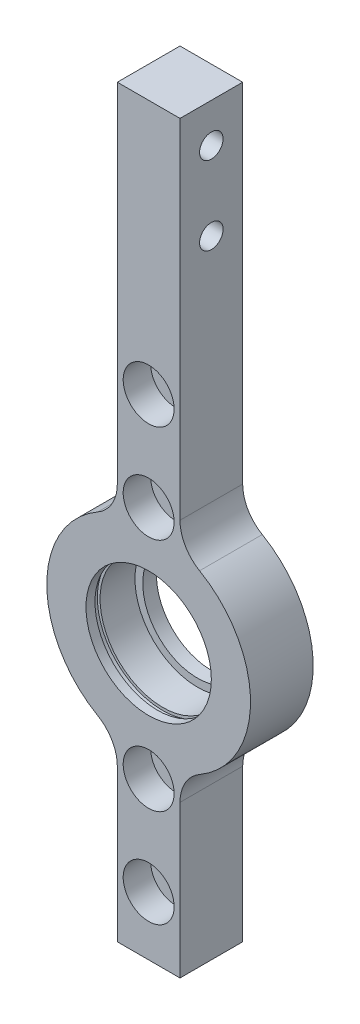
ISO-10303-21;
HEADER;
FILE_DESCRIPTION(('STEP AP214'),'2;1');
FILE_NAME('part.step','',(''),(''),'','','');
FILE_SCHEMA(('AUTOMOTIVE_DESIGN { 1 0 10303 214 1 1 1 1 }'));
ENDSEC;
DATA;
#1=APPLICATION_CONTEXT('core data for automotive mechanical design processes');
#2=APPLICATION_PROTOCOL_DEFINITION('international standard','automotive_design',2000,#1);
#3=PRODUCT_CONTEXT('',#1,'mechanical');
#4=PRODUCT('Part','Part','',(#3));
#5=PRODUCT_RELATED_PRODUCT_CATEGORY('part','',(#4));
#6=PRODUCT_DEFINITION_FORMATION('','',#4);
#7=PRODUCT_DEFINITION_CONTEXT('part definition',#1,'design');
#8=PRODUCT_DEFINITION('design','',#6,#7);
#9=PRODUCT_DEFINITION_SHAPE('','',#8);
#10=(LENGTH_UNIT() NAMED_UNIT(*) SI_UNIT(.MILLI.,.METRE.));
#11=(NAMED_UNIT(*) PLANE_ANGLE_UNIT() SI_UNIT($,.RADIAN.));
#12=(NAMED_UNIT(*) SI_UNIT($,.STERADIAN.) SOLID_ANGLE_UNIT());
#13=UNCERTAINTY_MEASURE_WITH_UNIT(LENGTH_MEASURE(1.E-05),#10,'distance_accuracy_value','');
#14=(GEOMETRIC_REPRESENTATION_CONTEXT(3) GLOBAL_UNCERTAINTY_ASSIGNED_CONTEXT((#13)) GLOBAL_UNIT_ASSIGNED_CONTEXT((#10,
#11,#12)) REPRESENTATION_CONTEXT('',''));
#15=CARTESIAN_POINT('',(0.,0.,0.));
#16=DIRECTION('',(0.,0.,1.));
#17=DIRECTION('',(1.,0.,0.));
#18=AXIS2_PLACEMENT_3D('',#15,#16,#17);
#19=CARTESIAN_POINT('',(0.,0.,-8.));
#20=DIRECTION('',(0.,0.,1.));
#21=DIRECTION('',(1.,0.,0.));
#22=AXIS2_PLACEMENT_3D('',#19,#20,#21);
#23=PLANE('',#22);
#24=CARTESIAN_POINT('',(0.,30.,-8.));
#25=DIRECTION('',(0.,0.,-1.));
#26=DIRECTION('',(1.,0.,0.));
#27=AXIS2_PLACEMENT_3D('',#24,#25,#26);
#28=CIRCLE('',#27,3.);
#29=CARTESIAN_POINT('',(3.,30.,-8.));
#30=VERTEX_POINT('',#29);
#31=EDGE_CURVE('E256',#30,#30,#28,.T.);
#32=ORIENTED_EDGE('',*,*,#31,.F.);
#33=EDGE_LOOP('',(#32));
#34=FACE_BOUND('',#33,.T.);
#35=CARTESIAN_POINT('',(0.,-55.,-8.));
#36=DIRECTION('',(0.,0.,1.));
#37=DIRECTION('',(1.,0.,0.));
#38=AXIS2_PLACEMENT_3D('',#35,#36,#37);
#39=CIRCLE('',#38,3.);
#40=CARTESIAN_POINT('',(3.00000000000001,-55.,-8.));
#41=VERTEX_POINT('',#40);
#42=EDGE_CURVE('E252',#41,#41,#39,.T.);
#43=ORIENTED_EDGE('',*,*,#42,.T.);
#44=EDGE_LOOP('',(#43));
#45=FACE_BOUND('',#44,.T.);
#46=CARTESIAN_POINT('',(0.,-30.,-8.));
#47=DIRECTION('',(0.,0.,1.));
#48=DIRECTION('',(1.,0.,0.));
#49=AXIS2_PLACEMENT_3D('',#46,#47,#48);
#50=CIRCLE('',#49,3.);
#51=CARTESIAN_POINT('',(3.,-30.,-8.));
#52=VERTEX_POINT('',#51);
#53=EDGE_CURVE('E249',#52,#52,#50,.T.);
#54=ORIENTED_EDGE('',*,*,#53,.T.);
#55=EDGE_LOOP('',(#54));
#56=FACE_BOUND('',#55,.T.);
#57=CARTESIAN_POINT('',(0.,0.,-8.));
#58=DIRECTION('',(0.,0.,1.));
#59=DIRECTION('',(1.,0.,0.));
#60=AXIS2_PLACEMENT_3D('',#57,#58,#59);
#61=CIRCLE('',#60,26.);
#62=CARTESIAN_POINT('',(13.,-22.5166604983954,-8.));
#63=VERTEX_POINT('',#62);
#64=CARTESIAN_POINT('',(13.,22.5166604983954,-8.));
#65=VERTEX_POINT('',#64);
#66=EDGE_CURVE('E207',#63,#65,#61,.T.);
#67=ORIENTED_EDGE('',*,*,#66,.F.);
#68=CARTESIAN_POINT('',(18.,-31.1769145362398,-8.));
#69=DIRECTION('',(0.,0.,1.));
#70=DIRECTION('',(1.,0.,0.));
#71=AXIS2_PLACEMENT_3D('',#68,#69,#70);
#72=CIRCLE('',#71,10.);
#73=CARTESIAN_POINT('',(8.,-31.1769145362398,-8.));
#74=VERTEX_POINT('',#73);
#75=EDGE_CURVE('E236',#63,#74,#72,.T.);
#76=ORIENTED_EDGE('',*,*,#75,.T.);
#77=DIRECTION('',(0.,1.,0.));
#78=VECTOR('',#77,1.);
#79=CARTESIAN_POINT('',(8.,-24.738633753706,-8.));
#80=LINE('',#79,#78);
#81=CARTESIAN_POINT('',(8.00000000000001,-70.,-8.));
#82=VERTEX_POINT('',#81);
#83=EDGE_CURVE('E139',#82,#74,#80,.T.);
#84=ORIENTED_EDGE('',*,*,#83,.F.);
#85=DIRECTION('',(1.,0.,0.));
#86=VECTOR('',#85,1.);
#87=CARTESIAN_POINT('',(-7.99999999999999,-70.,-8.));
#88=LINE('',#87,#86);
#89=CARTESIAN_POINT('',(-7.99999999999999,-70.,-8.));
#90=VERTEX_POINT('',#89);
#91=EDGE_CURVE('E160',#90,#82,#88,.T.);
#92=ORIENTED_EDGE('',*,*,#91,.F.);
#93=DIRECTION('',(0.,-1.,0.));
#94=VECTOR('',#93,1.);
#95=CARTESIAN_POINT('',(-8.,-24.738633753706,-8.));
#96=LINE('',#95,#94);
#97=CARTESIAN_POINT('',(-8.,-31.1769145362398,-8.));
#98=VERTEX_POINT('',#97);
#99=EDGE_CURVE('E145',#98,#90,#96,.T.);
#100=ORIENTED_EDGE('',*,*,#99,.F.);
#101=CARTESIAN_POINT('',(-18.,-31.1769145362398,-8.));
#102=DIRECTION('',(0.,0.,1.));
#103=DIRECTION('',(1.,0.,0.));
#104=AXIS2_PLACEMENT_3D('',#101,#102,#103);
#105=CIRCLE('',#104,10.);
#106=CARTESIAN_POINT('',(-13.,-22.5166604983954,-8.));
#107=VERTEX_POINT('',#106);
#108=EDGE_CURVE('E233',#98,#107,#105,.T.);
#109=ORIENTED_EDGE('',*,*,#108,.T.);
#110=CARTESIAN_POINT('',(-13.,22.5166604983954,-8.));
#111=VERTEX_POINT('',#110);
#112=EDGE_CURVE('E212',#111,#107,#61,.T.);
#113=ORIENTED_EDGE('',*,*,#112,.F.);
#114=CARTESIAN_POINT('',(-18.,31.1769145362398,-8.));
#115=DIRECTION('',(0.,0.,1.));
#116=DIRECTION('',(1.,0.,0.));
#117=AXIS2_PLACEMENT_3D('',#114,#115,#116);
#118=CIRCLE('',#117,10.);
#119=CARTESIAN_POINT('',(-8.00000000000001,31.1769145362398,-8.));
#120=VERTEX_POINT('',#119);
#121=EDGE_CURVE('E44',#111,#120,#118,.T.);
#122=ORIENTED_EDGE('',*,*,#121,.T.);
#123=DIRECTION('',(0.,-1.,0.));
#124=VECTOR('',#123,1.);
#125=CARTESIAN_POINT('',(-8.,120.,-8.));
#126=LINE('',#125,#124);
#127=CARTESIAN_POINT('',(-8.,120.,-8.));
#128=VERTEX_POINT('',#127);
#129=EDGE_CURVE('E190',#128,#120,#126,.T.);
#130=ORIENTED_EDGE('',*,*,#129,.F.);
#131=DIRECTION('',(-1.,0.,0.));
#132=VECTOR('',#131,1.);
#133=CARTESIAN_POINT('',(-8.,120.,-8.));
#134=LINE('',#133,#132);
#135=CARTESIAN_POINT('',(8.,120.,-8.));
#136=VERTEX_POINT('',#135);
#137=EDGE_CURVE('E196',#136,#128,#134,.T.);
#138=ORIENTED_EDGE('',*,*,#137,.F.);
#139=DIRECTION('',(0.,1.,0.));
#140=VECTOR('',#139,1.);
#141=CARTESIAN_POINT('',(8.,120.,-8.));
#142=LINE('',#141,#140);
#143=CARTESIAN_POINT('',(8.00000000000001,31.1769145362398,-8.));
#144=VERTEX_POINT('',#143);
#145=EDGE_CURVE('E186',#144,#136,#142,.T.);
#146=ORIENTED_EDGE('',*,*,#145,.F.);
#147=CARTESIAN_POINT('',(18.,31.1769145362398,-8.));
#148=DIRECTION('',(0.,0.,1.));
#149=DIRECTION('',(1.,0.,0.));
#150=AXIS2_PLACEMENT_3D('',#147,#148,#149);
#151=CIRCLE('',#150,10.);
#152=EDGE_CURVE('E240',#144,#65,#151,.T.);
#153=ORIENTED_EDGE('',*,*,#152,.T.);
#154=EDGE_LOOP('',(#67,#76,#84,#92,#100,#109,#113,#122,#130,#138,#146,#153));
#155=FACE_BOUND('',#154,.T.);
#156=CARTESIAN_POINT('',(0.,0.,-8.));
#157=DIRECTION('',(0.,0.,1.));
#158=DIRECTION('',(1.,0.,0.));
#159=AXIS2_PLACEMENT_3D('',#156,#157,#158);
#160=CIRCLE('',#159,14.);
#161=CARTESIAN_POINT('',(14.,0.,-8.));
#162=VERTEX_POINT('',#161);
#163=EDGE_CURVE('E204',#162,#162,#160,.T.);
#164=ORIENTED_EDGE('',*,*,#163,.T.);
#165=EDGE_LOOP('',(#164));
#166=FACE_BOUND('',#165,.T.);
#167=CARTESIAN_POINT('',(0.,55.,-8.));
#168=DIRECTION('',(0.,0.,-1.));
#169=DIRECTION('',(1.,0.,0.));
#170=AXIS2_PLACEMENT_3D('',#167,#168,#169);
#171=CIRCLE('',#170,3.);
#172=CARTESIAN_POINT('',(3.00000000000001,55.,-8.));
#173=VERTEX_POINT('',#172);
#174=EDGE_CURVE('E267',#173,#173,#171,.T.);
#175=ORIENTED_EDGE('',*,*,#174,.F.);
#176=EDGE_LOOP('',(#175));
#177=FACE_BOUND('',#176,.T.);
#178=ADVANCED_FACE('F35',(#34,#45,#56,#155,#166,#177),#23,.F.);
#179=CARTESIAN_POINT('',(0.,55.,1.));
#180=DIRECTION('',(0.,0.,1.));
#181=DIRECTION('',(1.,0.,0.));
#182=AXIS2_PLACEMENT_3D('',#179,#180,#181);
#183=PLANE('',#182);
#184=CARTESIAN_POINT('',(0.,55.,1.));
#185=DIRECTION('',(0.,0.,-1.));
#186=DIRECTION('',(1.,0.,0.));
#187=AXIS2_PLACEMENT_3D('',#184,#185,#186);
#188=CIRCLE('',#187,6.5);
#189=CARTESIAN_POINT('',(6.50000000000001,55.,1.));
#190=VERTEX_POINT('',#189);
#191=EDGE_CURVE('E273',#190,#190,#188,.T.);
#192=ORIENTED_EDGE('',*,*,#191,.F.);
#193=EDGE_LOOP('',(#192));
#194=FACE_BOUND('',#193,.T.);
#195=CARTESIAN_POINT('',(0.,55.,1.));
#196=DIRECTION('',(0.,0.,1.));
#197=DIRECTION('',(1.,0.,0.));
#198=AXIS2_PLACEMENT_3D('',#195,#196,#197);
#199=CIRCLE('',#198,3.);
#200=CARTESIAN_POINT('',(3.00000000000001,55.,1.));
#201=VERTEX_POINT('',#200);
#202=EDGE_CURVE('E39',#201,#201,#199,.F.);
#203=ORIENTED_EDGE('',*,*,#202,.T.);
#204=EDGE_LOOP('',(#203));
#205=FACE_BOUND('',#204,.T.);
#206=ADVANCED_FACE('F323',(#194,#205),#183,.T.);
#207=CARTESIAN_POINT('',(0.,30.,1.));
#208=DIRECTION('',(0.,0.,1.));
#209=DIRECTION('',(1.,0.,0.));
#210=AXIS2_PLACEMENT_3D('',#207,#208,#209);
#211=PLANE('',#210);
#212=CARTESIAN_POINT('',(0.,30.,1.));
#213=DIRECTION('',(0.,0.,-1.));
#214=DIRECTION('',(1.,0.,0.));
#215=AXIS2_PLACEMENT_3D('',#212,#213,#214);
#216=CIRCLE('',#215,6.5);
#217=CARTESIAN_POINT('',(6.5,30.,1.));
#218=VERTEX_POINT('',#217);
#219=EDGE_CURVE('E260',#218,#218,#216,.T.);
#220=ORIENTED_EDGE('',*,*,#219,.F.);
#221=EDGE_LOOP('',(#220));
#222=FACE_BOUND('',#221,.T.);
#223=CARTESIAN_POINT('',(0.,30.,1.));
#224=DIRECTION('',(0.,0.,1.));
#225=DIRECTION('',(1.,0.,0.));
#226=AXIS2_PLACEMENT_3D('',#223,#224,#225);
#227=CIRCLE('',#226,3.);
#228=CARTESIAN_POINT('',(3.,30.,1.));
#229=VERTEX_POINT('',#228);
#230=EDGE_CURVE('E253',#229,#229,#227,.F.);
#231=ORIENTED_EDGE('',*,*,#230,.T.);
#232=EDGE_LOOP('',(#231));
#233=FACE_BOUND('',#232,.T.);
#234=ADVANCED_FACE('F329',(#222,#233),#211,.T.);
#235=CARTESIAN_POINT('',(0.,0.,8.));
#236=DIRECTION('',(0.,0.,1.));
#237=DIRECTION('',(1.,0.,0.));
#238=AXIS2_PLACEMENT_3D('',#235,#236,#237);
#239=PLANE('',#238);
#240=CARTESIAN_POINT('',(0.,55.,8.));
#241=DIRECTION('',(0.,0.,-1.));
#242=DIRECTION('',(1.,0.,0.));
#243=AXIS2_PLACEMENT_3D('',#240,#241,#242);
#244=CIRCLE('',#243,6.5);
#245=CARTESIAN_POINT('',(6.50000000000001,55.,8.));
#246=VERTEX_POINT('',#245);
#247=EDGE_CURVE('E271',#246,#246,#244,.T.);
#248=ORIENTED_EDGE('',*,*,#247,.T.);
#249=EDGE_LOOP('',(#248));
#250=FACE_BOUND('',#249,.T.);
#251=CARTESIAN_POINT('',(0.,-30.,8.));
#252=DIRECTION('',(0.,0.,1.));
#253=DIRECTION('',(1.,0.,0.));
#254=AXIS2_PLACEMENT_3D('',#251,#252,#253);
#255=CIRCLE('',#254,6.5);
#256=CARTESIAN_POINT('',(6.5,-30.,8.));
#257=VERTEX_POINT('',#256);
#258=EDGE_CURVE('E248',#257,#257,#255,.T.);
#259=ORIENTED_EDGE('',*,*,#258,.F.);
#260=EDGE_LOOP('',(#259));
#261=FACE_BOUND('',#260,.T.);
#262=CARTESIAN_POINT('',(0.,-55.,8.));
#263=DIRECTION('',(0.,0.,1.));
#264=DIRECTION('',(1.,0.,0.));
#265=AXIS2_PLACEMENT_3D('',#262,#263,#264);
#266=CIRCLE('',#265,6.5);
#267=CARTESIAN_POINT('',(6.50000000000001,-55.,8.));
#268=VERTEX_POINT('',#267);
#269=EDGE_CURVE('E285',#268,#268,#266,.T.);
#270=ORIENTED_EDGE('',*,*,#269,.F.);
#271=EDGE_LOOP('',(#270));
#272=FACE_BOUND('',#271,.T.);
#273=DIRECTION('',(0.,1.,0.));
#274=VECTOR('',#273,1.);
#275=CARTESIAN_POINT('',(8.,-24.738633753706,8.));
#276=LINE('',#275,#274);
#277=CARTESIAN_POINT('',(8.00000000000001,-70.,8.));
#278=VERTEX_POINT('',#277);
#279=CARTESIAN_POINT('',(8.,-31.1769145362398,8.));
#280=VERTEX_POINT('',#279);
#281=EDGE_CURVE('E154',#278,#280,#276,.T.);
#282=ORIENTED_EDGE('',*,*,#281,.T.);
#283=CARTESIAN_POINT('',(18.,-31.1769145362398,8.));
#284=DIRECTION('',(0.,0.,1.));
#285=DIRECTION('',(1.,0.,0.));
#286=AXIS2_PLACEMENT_3D('',#283,#284,#285);
#287=CIRCLE('',#286,10.);
#288=CARTESIAN_POINT('',(13.,-22.5166604983954,8.));
#289=VERTEX_POINT('',#288);
#290=EDGE_CURVE('E238',#280,#289,#287,.F.);
#291=ORIENTED_EDGE('',*,*,#290,.T.);
#292=CARTESIAN_POINT('',(0.,0.,8.));
#293=DIRECTION('',(0.,0.,1.));
#294=DIRECTION('',(1.,0.,0.));
#295=AXIS2_PLACEMENT_3D('',#292,#293,#294);
#296=CIRCLE('',#295,26.);
#297=CARTESIAN_POINT('',(13.,22.5166604983954,8.));
#298=VERTEX_POINT('',#297);
#299=EDGE_CURVE('E208',#289,#298,#296,.T.);
#300=ORIENTED_EDGE('',*,*,#299,.T.);
#301=CARTESIAN_POINT('',(18.,31.1769145362398,8.));
#302=DIRECTION('',(0.,0.,1.));
#303=DIRECTION('',(1.,0.,0.));
#304=AXIS2_PLACEMENT_3D('',#301,#302,#303);
#305=CIRCLE('',#304,10.);
#306=CARTESIAN_POINT('',(8.00000000000001,31.1769145362398,8.));
#307=VERTEX_POINT('',#306);
#308=EDGE_CURVE('E242',#298,#307,#305,.F.);
#309=ORIENTED_EDGE('',*,*,#308,.T.);
#310=DIRECTION('',(0.,1.,0.));
#311=VECTOR('',#310,1.);
#312=CARTESIAN_POINT('',(8.,120.,8.));
#313=LINE('',#312,#311);
#314=CARTESIAN_POINT('',(8.,120.,8.));
#315=VERTEX_POINT('',#314);
#316=EDGE_CURVE('E187',#307,#315,#313,.T.);
#317=ORIENTED_EDGE('',*,*,#316,.T.);
#318=DIRECTION('',(-1.,0.,0.));
#319=VECTOR('',#318,1.);
#320=CARTESIAN_POINT('',(-8.,120.,8.));
#321=LINE('',#320,#319);
#322=CARTESIAN_POINT('',(-8.,120.,8.));
#323=VERTEX_POINT('',#322);
#324=EDGE_CURVE('E189',#315,#323,#321,.T.);
#325=ORIENTED_EDGE('',*,*,#324,.T.);
#326=DIRECTION('',(0.,-1.,0.));
#327=VECTOR('',#326,1.);
#328=CARTESIAN_POINT('',(-8.,120.,8.));
#329=LINE('',#328,#327);
#330=CARTESIAN_POINT('',(-8.00000000000001,31.1769145362398,8.));
#331=VERTEX_POINT('',#330);
#332=EDGE_CURVE('E192',#323,#331,#329,.T.);
#333=ORIENTED_EDGE('',*,*,#332,.T.);
#334=CARTESIAN_POINT('',(-18.,31.1769145362398,8.));
#335=DIRECTION('',(0.,0.,1.));
#336=DIRECTION('',(1.,0.,0.));
#337=AXIS2_PLACEMENT_3D('',#334,#335,#336);
#338=CIRCLE('',#337,10.);
#339=CARTESIAN_POINT('',(-13.,22.5166604983954,8.));
#340=VERTEX_POINT('',#339);
#341=EDGE_CURVE('E11',#331,#340,#338,.F.);
#342=ORIENTED_EDGE('',*,*,#341,.T.);
#343=CARTESIAN_POINT('',(-13.,-22.5166604983954,8.));
#344=VERTEX_POINT('',#343);
#345=EDGE_CURVE('E211',#340,#344,#296,.T.);
#346=ORIENTED_EDGE('',*,*,#345,.T.);
#347=CARTESIAN_POINT('',(-18.,-31.1769145362398,8.));
#348=DIRECTION('',(0.,0.,1.));
#349=DIRECTION('',(1.,0.,0.));
#350=AXIS2_PLACEMENT_3D('',#347,#348,#349);
#351=CIRCLE('',#350,10.);
#352=CARTESIAN_POINT('',(-8.,-31.1769145362398,8.));
#353=VERTEX_POINT('',#352);
#354=EDGE_CURVE('E135',#344,#353,#351,.F.);
#355=ORIENTED_EDGE('',*,*,#354,.T.);
#356=DIRECTION('',(0.,-1.,0.));
#357=VECTOR('',#356,1.);
#358=CARTESIAN_POINT('',(-8.,-24.738633753706,8.));
#359=LINE('',#358,#357);
#360=CARTESIAN_POINT('',(-7.99999999999999,-70.,8.));
#361=VERTEX_POINT('',#360);
#362=EDGE_CURVE('E125',#353,#361,#359,.T.);
#363=ORIENTED_EDGE('',*,*,#362,.T.);
#364=DIRECTION('',(1.,0.,0.));
#365=VECTOR('',#364,1.);
#366=CARTESIAN_POINT('',(-7.99999999999999,-70.,8.));
#367=LINE('',#366,#365);
#368=EDGE_CURVE('E131',#361,#278,#367,.T.);
#369=ORIENTED_EDGE('',*,*,#368,.T.);
#370=EDGE_LOOP('',(#282,#291,#300,#309,#317,#325,#333,#342,#346,#355,#363,#369));
#371=FACE_BOUND('',#370,.T.);
#372=CARTESIAN_POINT('',(0.,0.,8.));
#373=DIRECTION('',(0.,0.,1.));
#374=DIRECTION('',(1.,0.,0.));
#375=AXIS2_PLACEMENT_3D('',#372,#373,#374);
#376=CIRCLE('',#375,16.);
#377=CARTESIAN_POINT('',(16.,0.,8.));
#378=VERTEX_POINT('',#377);
#379=EDGE_CURVE('E177',#378,#378,#376,.T.);
#380=ORIENTED_EDGE('',*,*,#379,.F.);
#381=EDGE_LOOP('',(#380));
#382=FACE_BOUND('',#381,.T.);
#383=CARTESIAN_POINT('',(0.,30.,8.));
#384=DIRECTION('',(0.,0.,-1.));
#385=DIRECTION('',(1.,0.,0.));
#386=AXIS2_PLACEMENT_3D('',#383,#384,#385);
#387=CIRCLE('',#386,6.5);
#388=CARTESIAN_POINT('',(6.5,30.,8.));
#389=VERTEX_POINT('',#388);
#390=EDGE_CURVE('E255',#389,#389,#387,.T.);
#391=ORIENTED_EDGE('',*,*,#390,.T.);
#392=EDGE_LOOP('',(#391));
#393=FACE_BOUND('',#392,.T.);
#394=ADVANCED_FACE('F128',(#250,#261,#272,#371,#382,#393),#239,.T.);
#395=CARTESIAN_POINT('',(0.,0.,8.));
#396=DIRECTION('',(0.,0.,-1.));
#397=DIRECTION('',(-1.,0.,0.));
#398=AXIS2_PLACEMENT_3D('',#395,#396,#397);
#399=CYLINDRICAL_SURFACE('',#398,26.);
#400=ORIENTED_EDGE('',*,*,#112,.T.);
#401=DIRECTION('',(0.,0.,-1.));
#402=VECTOR('',#401,1.);
#403=CARTESIAN_POINT('',(-13.,-22.5166604983954,8.));
#404=LINE('',#403,#402);
#405=EDGE_CURVE('E220',#107,#344,#404,.F.);
#406=ORIENTED_EDGE('',*,*,#405,.T.);
#407=ORIENTED_EDGE('',*,*,#345,.F.);
#408=DIRECTION('',(0.,0.,-1.));
#409=VECTOR('',#408,1.);
#410=CARTESIAN_POINT('',(-13.,22.5166604983954,8.));
#411=LINE('',#410,#409);
#412=EDGE_CURVE('E217',#340,#111,#411,.T.);
#413=ORIENTED_EDGE('',*,*,#412,.T.);
#414=EDGE_LOOP('',(#400,#406,#407,#413));
#415=FACE_BOUND('',#414,.T.);
#416=ADVANCED_FACE('F336',(#415),#399,.T.);
#417=ORIENTED_EDGE('',*,*,#299,.F.);
#418=DIRECTION('',(0.,0.,-1.));
#419=VECTOR('',#418,1.);
#420=CARTESIAN_POINT('',(13.,-22.5166604983954,8.));
#421=LINE('',#420,#419);
#422=EDGE_CURVE('E224',#289,#63,#421,.T.);
#423=ORIENTED_EDGE('',*,*,#422,.T.);
#424=ORIENTED_EDGE('',*,*,#66,.T.);
#425=DIRECTION('',(0.,0.,-1.));
#426=VECTOR('',#425,1.);
#427=CARTESIAN_POINT('',(13.,22.5166604983954,8.));
#428=LINE('',#427,#426);
#429=EDGE_CURVE('E222',#65,#298,#428,.F.);
#430=ORIENTED_EDGE('',*,*,#429,.T.);
#431=EDGE_LOOP('',(#417,#423,#424,#430));
#432=FACE_BOUND('',#431,.T.);
#433=ADVANCED_FACE('F339',(#432),#399,.T.);
#434=CARTESIAN_POINT('',(0.,0.,0.));
#435=DIRECTION('',(0.,0.,1.));
#436=DIRECTION('',(1.,0.,0.));
#437=AXIS2_PLACEMENT_3D('',#434,#435,#436);
#438=CYLINDRICAL_SURFACE('',#437,16.);
#439=CARTESIAN_POINT('',(0.,0.,-4.5));
#440=DIRECTION('',(0.,0.,1.));
#441=DIRECTION('',(1.,0.,0.));
#442=AXIS2_PLACEMENT_3D('',#439,#440,#441);
#443=CIRCLE('',#442,16.);
#444=CARTESIAN_POINT('',(16.,0.,-4.5));
#445=VERTEX_POINT('',#444);
#446=EDGE_CURVE('E180',#445,#445,#443,.T.);
#447=ORIENTED_EDGE('',*,*,#446,.F.);
#448=EDGE_LOOP('',(#447));
#449=FACE_BOUND('',#448,.T.);
#450=CARTESIAN_POINT('',(0.,0.,4.4));
#451=DIRECTION('',(0.,0.,1.));
#452=DIRECTION('',(1.,0.,0.));
#453=AXIS2_PLACEMENT_3D('',#450,#451,#452);
#454=CIRCLE('',#453,16.);
#455=CARTESIAN_POINT('',(16.,0.,4.4));
#456=VERTEX_POINT('',#455);
#457=EDGE_CURVE('E174',#456,#456,#454,.T.);
#458=ORIENTED_EDGE('',*,*,#457,.T.);
#459=EDGE_LOOP('',(#458));
#460=FACE_BOUND('',#459,.T.);
#461=ADVANCED_FACE('F404',(#449,#460),#438,.F.);
#462=ORIENTED_EDGE('',*,*,#379,.T.);
#463=EDGE_LOOP('',(#462));
#464=FACE_BOUND('',#463,.T.);
#465=CARTESIAN_POINT('',(0.,0.,5.7));
#466=DIRECTION('',(0.,0.,1.));
#467=DIRECTION('',(1.,0.,0.));
#468=AXIS2_PLACEMENT_3D('',#465,#466,#467);
#469=CIRCLE('',#468,16.);
#470=CARTESIAN_POINT('',(16.,0.,5.7));
#471=VERTEX_POINT('',#470);
#472=EDGE_CURVE('E148',#471,#471,#469,.T.);
#473=ORIENTED_EDGE('',*,*,#472,.F.);
#474=EDGE_LOOP('',(#473));
#475=FACE_BOUND('',#474,.T.);
#476=ADVANCED_FACE('F399',(#464,#475),#438,.F.);
#477=CARTESIAN_POINT('',(0.,0.,8.));
#478=DIRECTION('',(0.,0.,-1.));
#479=DIRECTION('',(-1.,0.,0.));
#480=AXIS2_PLACEMENT_3D('',#477,#478,#479);
#481=CYLINDRICAL_SURFACE('',#480,14.);
#482=ORIENTED_EDGE('',*,*,#163,.F.);
#483=EDGE_LOOP('',(#482));
#484=FACE_BOUND('',#483,.T.);
#485=CARTESIAN_POINT('',(0.,0.,-4.5));
#486=DIRECTION('',(0.,0.,1.));
#487=DIRECTION('',(1.,0.,0.));
#488=AXIS2_PLACEMENT_3D('',#485,#486,#487);
#489=CIRCLE('',#488,14.);
#490=CARTESIAN_POINT('',(14.,0.,-4.5));
#491=VERTEX_POINT('',#490);
#492=EDGE_CURVE('E183',#491,#491,#489,.T.);
#493=ORIENTED_EDGE('',*,*,#492,.T.);
#494=EDGE_LOOP('',(#493));
#495=FACE_BOUND('',#494,.T.);
#496=ADVANCED_FACE('F396',(#484,#495),#481,.F.);
#497=CARTESIAN_POINT('',(8.,120.,8.));
#498=DIRECTION('',(-1.,0.,0.));
#499=DIRECTION('',(0.,-1.,0.));
#500=AXIS2_PLACEMENT_3D('',#497,#498,#499);
#501=PLANE('',#500);
#502=CARTESIAN_POINT('',(8.,89.9999999999997,0.));
#503=DIRECTION('',(-1.,0.,0.));
#504=DIRECTION('',(0.,-1.,0.));
#505=AXIS2_PLACEMENT_3D('',#502,#503,#504);
#506=CIRCLE('',#505,3.);
#507=CARTESIAN_POINT('',(8.,86.9999999999997,0.));
#508=VERTEX_POINT('',#507);
#509=EDGE_CURVE('E296',#508,#508,#506,.T.);
#510=ORIENTED_EDGE('',*,*,#509,.T.);
#511=EDGE_LOOP('',(#510));
#512=FACE_BOUND('',#511,.T.);
#513=CARTESIAN_POINT('',(8.,110.,0.));
#514=DIRECTION('',(-1.,0.,0.));
#515=DIRECTION('',(0.,-1.,0.));
#516=AXIS2_PLACEMENT_3D('',#513,#514,#515);
#517=CIRCLE('',#516,3.);
#518=CARTESIAN_POINT('',(8.,107.,0.));
#519=VERTEX_POINT('',#518);
#520=EDGE_CURVE('E161',#519,#519,#517,.T.);
#521=ORIENTED_EDGE('',*,*,#520,.T.);
#522=EDGE_LOOP('',(#521));
#523=FACE_BOUND('',#522,.T.);
#524=ORIENTED_EDGE('',*,*,#316,.F.);
#525=DIRECTION('',(0.,0.,1.));
#526=VECTOR('',#525,1.);
#527=CARTESIAN_POINT('',(8.00000000000001,31.1769145362398,-8.));
#528=LINE('',#527,#526);
#529=EDGE_CURVE('E229',#307,#144,#528,.F.);
#530=ORIENTED_EDGE('',*,*,#529,.T.);
#531=ORIENTED_EDGE('',*,*,#145,.T.);
#532=DIRECTION('',(0.,0.,-1.));
#533=VECTOR('',#532,1.);
#534=CARTESIAN_POINT('',(8.,120.,8.));
#535=LINE('',#534,#533);
#536=EDGE_CURVE('E201',#315,#136,#535,.T.);
#537=ORIENTED_EDGE('',*,*,#536,.F.);
#538=EDGE_LOOP('',(#524,#530,#531,#537));
#539=FACE_BOUND('',#538,.T.);
#540=ADVANCED_FACE('F304',(#512,#523,#539),#501,.F.);
#541=CARTESIAN_POINT('',(-8.,120.,8.));
#542=DIRECTION('',(0.,-1.,0.));
#543=DIRECTION('',(0.,0.,-1.));
#544=AXIS2_PLACEMENT_3D('',#541,#542,#543);
#545=PLANE('',#544);
#546=ORIENTED_EDGE('',*,*,#137,.T.);
#547=DIRECTION('',(0.,0.,-1.));
#548=VECTOR('',#547,1.);
#549=CARTESIAN_POINT('',(-8.,120.,8.));
#550=LINE('',#549,#548);
#551=EDGE_CURVE('E194',#323,#128,#550,.T.);
#552=ORIENTED_EDGE('',*,*,#551,.F.);
#553=ORIENTED_EDGE('',*,*,#324,.F.);
#554=ORIENTED_EDGE('',*,*,#536,.T.);
#555=EDGE_LOOP('',(#546,#552,#553,#554));
#556=FACE_BOUND('',#555,.T.);
#557=ADVANCED_FACE('F363',(#556),#545,.F.);
#558=CARTESIAN_POINT('',(-8.,120.,8.));
#559=DIRECTION('',(1.,0.,0.));
#560=DIRECTION('',(0.,1.,0.));
#561=AXIS2_PLACEMENT_3D('',#558,#559,#560);
#562=PLANE('',#561);
#563=CARTESIAN_POINT('',(-7.99999999999998,89.9999999999997,0.));
#564=DIRECTION('',(-1.,0.,0.));
#565=DIRECTION('',(0.,-1.,0.));
#566=AXIS2_PLACEMENT_3D('',#563,#564,#565);
#567=CIRCLE('',#566,3.);
#568=CARTESIAN_POINT('',(-7.99999999999998,86.9999999999997,0.));
#569=VERTEX_POINT('',#568);
#570=EDGE_CURVE('E291',#569,#569,#567,.T.);
#571=ORIENTED_EDGE('',*,*,#570,.F.);
#572=EDGE_LOOP('',(#571));
#573=FACE_BOUND('',#572,.T.);
#574=CARTESIAN_POINT('',(-7.99999999999998,110.,0.));
#575=DIRECTION('',(-1.,0.,0.));
#576=DIRECTION('',(0.,-1.,0.));
#577=AXIS2_PLACEMENT_3D('',#574,#575,#576);
#578=CIRCLE('',#577,3.);
#579=CARTESIAN_POINT('',(-7.99999999999998,107.,0.));
#580=VERTEX_POINT('',#579);
#581=EDGE_CURVE('E299',#580,#580,#578,.T.);
#582=ORIENTED_EDGE('',*,*,#581,.F.);
#583=EDGE_LOOP('',(#582));
#584=FACE_BOUND('',#583,.T.);
#585=ORIENTED_EDGE('',*,*,#129,.T.);
#586=DIRECTION('',(0.,0.,1.));
#587=VECTOR('',#586,1.);
#588=CARTESIAN_POINT('',(-8.00000000000001,31.1769145362398,8.));
#589=LINE('',#588,#587);
#590=EDGE_CURVE('E52',#120,#331,#589,.T.);
#591=ORIENTED_EDGE('',*,*,#590,.T.);
#592=ORIENTED_EDGE('',*,*,#332,.F.);
#593=ORIENTED_EDGE('',*,*,#551,.T.);
#594=EDGE_LOOP('',(#585,#591,#592,#593));
#595=FACE_BOUND('',#594,.T.);
#596=ADVANCED_FACE('F378',(#573,#584,#595),#562,.F.);
#597=CARTESIAN_POINT('',(0.,14.,-4.5));
#598=DIRECTION('',(0.,0.,1.));
#599=DIRECTION('',(1.,0.,0.));
#600=AXIS2_PLACEMENT_3D('',#597,#598,#599);
#601=PLANE('',#600);
#602=ORIENTED_EDGE('',*,*,#446,.T.);
#603=EDGE_LOOP('',(#602));
#604=FACE_BOUND('',#603,.T.);
#605=ORIENTED_EDGE('',*,*,#492,.F.);
#606=EDGE_LOOP('',(#605));
#607=FACE_BOUND('',#606,.T.);
#608=ADVANCED_FACE('F380',(#604,#607),#601,.T.);
#609=CARTESIAN_POINT('',(0.,16.,4.4));
#610=DIRECTION('',(0.,0.,1.));
#611=DIRECTION('',(1.,0.,0.));
#612=AXIS2_PLACEMENT_3D('',#609,#610,#611);
#613=PLANE('',#612);
#614=CARTESIAN_POINT('',(0.,0.,4.4));
#615=DIRECTION('',(0.,0.,1.));
#616=DIRECTION('',(1.,0.,0.));
#617=AXIS2_PLACEMENT_3D('',#614,#615,#616);
#618=CIRCLE('',#617,16.7);
#619=CARTESIAN_POINT('',(16.7,0.,4.4));
#620=VERTEX_POINT('',#619);
#621=EDGE_CURVE('E171',#620,#620,#618,.T.);
#622=ORIENTED_EDGE('',*,*,#621,.T.);
#623=EDGE_LOOP('',(#622));
#624=FACE_BOUND('',#623,.T.);
#625=ORIENTED_EDGE('',*,*,#457,.F.);
#626=EDGE_LOOP('',(#625));
#627=FACE_BOUND('',#626,.T.);
#628=ADVANCED_FACE('F387',(#624,#627),#613,.T.);
#629=CARTESIAN_POINT('',(0.,0.,0.));
#630=DIRECTION('',(0.,0.,1.));
#631=DIRECTION('',(1.,0.,0.));
#632=AXIS2_PLACEMENT_3D('',#629,#630,#631);
#633=CYLINDRICAL_SURFACE('',#632,16.7);
#634=CARTESIAN_POINT('',(0.,0.,5.7));
#635=DIRECTION('',(0.,0.,1.));
#636=DIRECTION('',(1.,0.,0.));
#637=AXIS2_PLACEMENT_3D('',#634,#635,#636);
#638=CIRCLE('',#637,16.7);
#639=CARTESIAN_POINT('',(16.7,0.,5.7));
#640=VERTEX_POINT('',#639);
#641=EDGE_CURVE('E168',#640,#640,#638,.T.);
#642=ORIENTED_EDGE('',*,*,#641,.T.);
#643=EDGE_LOOP('',(#642));
#644=FACE_BOUND('',#643,.T.);
#645=ORIENTED_EDGE('',*,*,#621,.F.);
#646=EDGE_LOOP('',(#645));
#647=FACE_BOUND('',#646,.T.);
#648=ADVANCED_FACE('F510',(#644,#647),#633,.F.);
#649=CARTESIAN_POINT('',(0.,16.7,5.7));
#650=DIRECTION('',(0.,0.,-1.));
#651=DIRECTION('',(-1.,0.,0.));
#652=AXIS2_PLACEMENT_3D('',#649,#650,#651);
#653=PLANE('',#652);
#654=ORIENTED_EDGE('',*,*,#472,.T.);
#655=EDGE_LOOP('',(#654));
#656=FACE_BOUND('',#655,.T.);
#657=ORIENTED_EDGE('',*,*,#641,.F.);
#658=EDGE_LOOP('',(#657));
#659=FACE_BOUND('',#658,.T.);
#660=ADVANCED_FACE('F520',(#656,#659),#653,.T.);
#661=CARTESIAN_POINT('',(-8.,-24.738633753706,8.));
#662=DIRECTION('',(1.,0.,0.));
#663=DIRECTION('',(0.,1.,0.));
#664=AXIS2_PLACEMENT_3D('',#661,#662,#663);
#665=PLANE('',#664);
#666=ORIENTED_EDGE('',*,*,#362,.F.);
#667=DIRECTION('',(0.,0.,1.));
#668=VECTOR('',#667,1.);
#669=CARTESIAN_POINT('',(-8.,-31.1769145362398,-8.));
#670=LINE('',#669,#668);
#671=EDGE_CURVE('E215',#353,#98,#670,.F.);
#672=ORIENTED_EDGE('',*,*,#671,.T.);
#673=ORIENTED_EDGE('',*,*,#99,.T.);
#674=DIRECTION('',(0.,0.,-1.));
#675=VECTOR('',#674,1.);
#676=CARTESIAN_POINT('',(-7.99999999999999,-70.,8.));
#677=LINE('',#676,#675);
#678=EDGE_CURVE('E142',#361,#90,#677,.T.);
#679=ORIENTED_EDGE('',*,*,#678,.F.);
#680=EDGE_LOOP('',(#666,#672,#673,#679));
#681=FACE_BOUND('',#680,.T.);
#682=ADVANCED_FACE('F143',(#681),#665,.F.);
#683=CARTESIAN_POINT('',(-7.99999999999999,-70.,8.));
#684=DIRECTION('',(0.,1.,0.));
#685=DIRECTION('',(0.,0.,1.));
#686=AXIS2_PLACEMENT_3D('',#683,#684,#685);
#687=PLANE('',#686);
#688=ORIENTED_EDGE('',*,*,#91,.T.);
#689=DIRECTION('',(0.,0.,-1.));
#690=VECTOR('',#689,1.);
#691=CARTESIAN_POINT('',(8.00000000000001,-70.,8.));
#692=LINE('',#691,#690);
#693=EDGE_CURVE('E149',#278,#82,#692,.T.);
#694=ORIENTED_EDGE('',*,*,#693,.F.);
#695=ORIENTED_EDGE('',*,*,#368,.F.);
#696=ORIENTED_EDGE('',*,*,#678,.T.);
#697=EDGE_LOOP('',(#688,#694,#695,#696));
#698=FACE_BOUND('',#697,.T.);
#699=ADVANCED_FACE('F151',(#698),#687,.F.);
#700=CARTESIAN_POINT('',(8.,-24.738633753706,8.));
#701=DIRECTION('',(-1.,0.,0.));
#702=DIRECTION('',(0.,-1.,0.));
#703=AXIS2_PLACEMENT_3D('',#700,#701,#702);
#704=PLANE('',#703);
#705=ORIENTED_EDGE('',*,*,#83,.T.);
#706=DIRECTION('',(0.,0.,1.));
#707=VECTOR('',#706,1.);
#708=CARTESIAN_POINT('',(8.,-31.1769145362398,8.));
#709=LINE('',#708,#707);
#710=EDGE_CURVE('E227',#74,#280,#709,.T.);
#711=ORIENTED_EDGE('',*,*,#710,.T.);
#712=ORIENTED_EDGE('',*,*,#281,.F.);
#713=ORIENTED_EDGE('',*,*,#693,.T.);
#714=EDGE_LOOP('',(#705,#711,#712,#713));
#715=FACE_BOUND('',#714,.T.);
#716=ADVANCED_FACE('F345',(#715),#704,.F.);
#717=CARTESIAN_POINT('',(-18.,-31.1769145362398,8.));
#718=DIRECTION('',(0.,0.,-1.));
#719=DIRECTION('',(-1.,0.,0.));
#720=AXIS2_PLACEMENT_3D('',#717,#718,#719);
#721=CYLINDRICAL_SURFACE('',#720,10.);
#722=ORIENTED_EDGE('',*,*,#354,.F.);
#723=ORIENTED_EDGE('',*,*,#405,.F.);
#724=ORIENTED_EDGE('',*,*,#108,.F.);
#725=ORIENTED_EDGE('',*,*,#671,.F.);
#726=EDGE_LOOP('',(#722,#723,#724,#725));
#727=FACE_BOUND('',#726,.T.);
#728=ADVANCED_FACE('F341',(#727),#721,.F.);
#729=CARTESIAN_POINT('',(18.,-31.1769145362398,8.));
#730=DIRECTION('',(0.,0.,-1.));
#731=DIRECTION('',(-1.,0.,0.));
#732=AXIS2_PLACEMENT_3D('',#729,#730,#731);
#733=CYLINDRICAL_SURFACE('',#732,10.);
#734=ORIENTED_EDGE('',*,*,#290,.F.);
#735=ORIENTED_EDGE('',*,*,#710,.F.);
#736=ORIENTED_EDGE('',*,*,#75,.F.);
#737=ORIENTED_EDGE('',*,*,#422,.F.);
#738=EDGE_LOOP('',(#734,#735,#736,#737));
#739=FACE_BOUND('',#738,.T.);
#740=ADVANCED_FACE('F344',(#739),#733,.F.);
#741=CARTESIAN_POINT('',(18.,31.1769145362398,8.));
#742=DIRECTION('',(0.,0.,-1.));
#743=DIRECTION('',(-1.,0.,0.));
#744=AXIS2_PLACEMENT_3D('',#741,#742,#743);
#745=CYLINDRICAL_SURFACE('',#744,10.);
#746=ORIENTED_EDGE('',*,*,#308,.F.);
#747=ORIENTED_EDGE('',*,*,#429,.F.);
#748=ORIENTED_EDGE('',*,*,#152,.F.);
#749=ORIENTED_EDGE('',*,*,#529,.F.);
#750=EDGE_LOOP('',(#746,#747,#748,#749));
#751=FACE_BOUND('',#750,.T.);
#752=ADVANCED_FACE('F319',(#751),#745,.F.);
#753=CARTESIAN_POINT('',(-18.,31.1769145362398,8.));
#754=DIRECTION('',(0.,0.,-1.));
#755=DIRECTION('',(-1.,0.,0.));
#756=AXIS2_PLACEMENT_3D('',#753,#754,#755);
#757=CYLINDRICAL_SURFACE('',#756,10.);
#758=ORIENTED_EDGE('',*,*,#341,.F.);
#759=ORIENTED_EDGE('',*,*,#590,.F.);
#760=ORIENTED_EDGE('',*,*,#121,.F.);
#761=ORIENTED_EDGE('',*,*,#412,.F.);
#762=EDGE_LOOP('',(#758,#759,#760,#761));
#763=FACE_BOUND('',#762,.T.);
#764=ADVANCED_FACE('F37',(#763),#757,.F.);
#765=CARTESIAN_POINT('',(26.,110.,0.));
#766=DIRECTION('',(-1.,0.,0.));
#767=DIRECTION('',(0.,-1.,0.));
#768=AXIS2_PLACEMENT_3D('',#765,#766,#767);
#769=CYLINDRICAL_SURFACE('',#768,3.);
#770=ORIENTED_EDGE('',*,*,#581,.T.);
#771=EDGE_LOOP('',(#770));
#772=FACE_BOUND('',#771,.T.);
#773=ORIENTED_EDGE('',*,*,#520,.F.);
#774=EDGE_LOOP('',(#773));
#775=FACE_BOUND('',#774,.T.);
#776=ADVANCED_FACE('F307',(#772,#775),#769,.F.);
#777=CARTESIAN_POINT('',(26.,89.9999999999997,0.));
#778=DIRECTION('',(-1.,0.,0.));
#779=DIRECTION('',(0.,-1.,0.));
#780=AXIS2_PLACEMENT_3D('',#777,#778,#779);
#781=CYLINDRICAL_SURFACE('',#780,3.);
#782=ORIENTED_EDGE('',*,*,#570,.T.);
#783=EDGE_LOOP('',(#782));
#784=FACE_BOUND('',#783,.T.);
#785=ORIENTED_EDGE('',*,*,#509,.F.);
#786=EDGE_LOOP('',(#785));
#787=FACE_BOUND('',#786,.T.);
#788=ADVANCED_FACE('F309',(#784,#787),#781,.F.);
#789=CARTESIAN_POINT('',(0.,-55.,1.));
#790=DIRECTION('',(0.,0.,1.));
#791=DIRECTION('',(1.,0.,0.));
#792=AXIS2_PLACEMENT_3D('',#789,#790,#791);
#793=CYLINDRICAL_SURFACE('',#792,6.5);
#794=CARTESIAN_POINT('',(0.,-55.,1.));
#795=DIRECTION('',(0.,0.,1.));
#796=DIRECTION('',(1.,0.,0.));
#797=AXIS2_PLACEMENT_3D('',#794,#795,#796);
#798=CIRCLE('',#797,6.5);
#799=CARTESIAN_POINT('',(6.50000000000001,-55.,1.));
#800=VERTEX_POINT('',#799);
#801=EDGE_CURVE('E288',#800,#800,#798,.T.);
#802=ORIENTED_EDGE('',*,*,#801,.F.);
#803=EDGE_LOOP('',(#802));
#804=FACE_BOUND('',#803,.T.);
#805=ORIENTED_EDGE('',*,*,#269,.T.);
#806=EDGE_LOOP('',(#805));
#807=FACE_BOUND('',#806,.T.);
#808=ADVANCED_FACE('F316',(#804,#807),#793,.F.);
#809=CARTESIAN_POINT('',(0.,-55.,1.));
#810=DIRECTION('',(0.,0.,1.));
#811=DIRECTION('',(1.,0.,0.));
#812=AXIS2_PLACEMENT_3D('',#809,#810,#811);
#813=PLANE('',#812);
#814=CARTESIAN_POINT('',(0.,-55.,1.));
#815=DIRECTION('',(0.,0.,1.));
#816=DIRECTION('',(1.,0.,0.));
#817=AXIS2_PLACEMENT_3D('',#814,#815,#816);
#818=CIRCLE('',#817,3.);
#819=CARTESIAN_POINT('',(3.00000000000001,-55.,1.));
#820=VERTEX_POINT('',#819);
#821=EDGE_CURVE('E250',#820,#820,#818,.T.);
#822=ORIENTED_EDGE('',*,*,#821,.F.);
#823=EDGE_LOOP('',(#822));
#824=FACE_BOUND('',#823,.T.);
#825=ORIENTED_EDGE('',*,*,#801,.T.);
#826=EDGE_LOOP('',(#825));
#827=FACE_BOUND('',#826,.T.);
#828=ADVANCED_FACE('F452',(#824,#827),#813,.T.);
#829=CARTESIAN_POINT('',(0.,-30.,1.));
#830=DIRECTION('',(0.,0.,1.));
#831=DIRECTION('',(1.,0.,0.));
#832=AXIS2_PLACEMENT_3D('',#829,#830,#831);
#833=CYLINDRICAL_SURFACE('',#832,6.5);
#834=CARTESIAN_POINT('',(0.,-30.,1.));
#835=DIRECTION('',(0.,0.,1.));
#836=DIRECTION('',(1.,0.,0.));
#837=AXIS2_PLACEMENT_3D('',#834,#835,#836);
#838=CIRCLE('',#837,6.5);
#839=CARTESIAN_POINT('',(6.5,-30.,1.));
#840=VERTEX_POINT('',#839);
#841=EDGE_CURVE('E282',#840,#840,#838,.T.);
#842=ORIENTED_EDGE('',*,*,#841,.F.);
#843=EDGE_LOOP('',(#842));
#844=FACE_BOUND('',#843,.T.);
#845=ORIENTED_EDGE('',*,*,#258,.T.);
#846=EDGE_LOOP('',(#845));
#847=FACE_BOUND('',#846,.T.);
#848=ADVANCED_FACE('F448',(#844,#847),#833,.F.);
#849=CARTESIAN_POINT('',(0.,-30.,1.));
#850=DIRECTION('',(0.,0.,1.));
#851=DIRECTION('',(1.,0.,0.));
#852=AXIS2_PLACEMENT_3D('',#849,#850,#851);
#853=PLANE('',#852);
#854=CARTESIAN_POINT('',(0.,-30.,1.));
#855=DIRECTION('',(0.,0.,1.));
#856=DIRECTION('',(1.,0.,0.));
#857=AXIS2_PLACEMENT_3D('',#854,#855,#856);
#858=CIRCLE('',#857,3.);
#859=CARTESIAN_POINT('',(3.,-30.,1.));
#860=VERTEX_POINT('',#859);
#861=EDGE_CURVE('E245',#860,#860,#858,.T.);
#862=ORIENTED_EDGE('',*,*,#861,.F.);
#863=EDGE_LOOP('',(#862));
#864=FACE_BOUND('',#863,.T.);
#865=ORIENTED_EDGE('',*,*,#841,.T.);
#866=EDGE_LOOP('',(#865));
#867=FACE_BOUND('',#866,.T.);
#868=ADVANCED_FACE('F444',(#864,#867),#853,.T.);
#869=CARTESIAN_POINT('',(0.,-30.,-8.));
#870=DIRECTION('',(0.,0.,1.));
#871=DIRECTION('',(1.,0.,0.));
#872=AXIS2_PLACEMENT_3D('',#869,#870,#871);
#873=CYLINDRICAL_SURFACE('',#872,3.);
#874=ORIENTED_EDGE('',*,*,#861,.T.);
#875=EDGE_LOOP('',(#874));
#876=FACE_BOUND('',#875,.T.);
#877=ORIENTED_EDGE('',*,*,#53,.F.);
#878=EDGE_LOOP('',(#877));
#879=FACE_BOUND('',#878,.T.);
#880=ADVANCED_FACE('F440',(#876,#879),#873,.F.);
#881=CARTESIAN_POINT('',(0.,-55.,-8.));
#882=DIRECTION('',(0.,0.,1.));
#883=DIRECTION('',(1.,0.,0.));
#884=AXIS2_PLACEMENT_3D('',#881,#882,#883);
#885=CYLINDRICAL_SURFACE('',#884,3.);
#886=ORIENTED_EDGE('',*,*,#821,.T.);
#887=EDGE_LOOP('',(#886));
#888=FACE_BOUND('',#887,.T.);
#889=ORIENTED_EDGE('',*,*,#42,.F.);
#890=EDGE_LOOP('',(#889));
#891=FACE_BOUND('',#890,.T.);
#892=ADVANCED_FACE('F436',(#888,#891),#885,.F.);
#893=CARTESIAN_POINT('',(0.,55.,1.));
#894=DIRECTION('',(0.,0.,1.));
#895=DIRECTION('',(1.,0.,0.));
#896=AXIS2_PLACEMENT_3D('',#893,#894,#895);
#897=CYLINDRICAL_SURFACE('',#896,6.5);
#898=ORIENTED_EDGE('',*,*,#191,.T.);
#899=EDGE_LOOP('',(#898));
#900=FACE_BOUND('',#899,.T.);
#901=ORIENTED_EDGE('',*,*,#247,.F.);
#902=EDGE_LOOP('',(#901));
#903=FACE_BOUND('',#902,.T.);
#904=ADVANCED_FACE('F431',(#900,#903),#897,.F.);
#905=CARTESIAN_POINT('',(0.,30.,1.));
#906=DIRECTION('',(0.,0.,1.));
#907=DIRECTION('',(1.,0.,0.));
#908=AXIS2_PLACEMENT_3D('',#905,#906,#907);
#909=CYLINDRICAL_SURFACE('',#908,6.5);
#910=ORIENTED_EDGE('',*,*,#219,.T.);
#911=EDGE_LOOP('',(#910));
#912=FACE_BOUND('',#911,.T.);
#913=ORIENTED_EDGE('',*,*,#390,.F.);
#914=EDGE_LOOP('',(#913));
#915=FACE_BOUND('',#914,.T.);
#916=ADVANCED_FACE('F422',(#912,#915),#909,.F.);
#917=CARTESIAN_POINT('',(0.,30.,-8.));
#918=DIRECTION('',(0.,0.,1.));
#919=DIRECTION('',(1.,0.,0.));
#920=AXIS2_PLACEMENT_3D('',#917,#918,#919);
#921=CYLINDRICAL_SURFACE('',#920,3.);
#922=ORIENTED_EDGE('',*,*,#230,.F.);
#923=EDGE_LOOP('',(#922));
#924=FACE_BOUND('',#923,.T.);
#925=ORIENTED_EDGE('',*,*,#31,.T.);
#926=EDGE_LOOP('',(#925));
#927=FACE_BOUND('',#926,.T.);
#928=ADVANCED_FACE('F416',(#924,#927),#921,.F.);
#929=CARTESIAN_POINT('',(0.,55.,-8.));
#930=DIRECTION('',(0.,0.,1.));
#931=DIRECTION('',(1.,0.,0.));
#932=AXIS2_PLACEMENT_3D('',#929,#930,#931);
#933=CYLINDRICAL_SURFACE('',#932,3.);
#934=ORIENTED_EDGE('',*,*,#202,.F.);
#935=EDGE_LOOP('',(#934));
#936=FACE_BOUND('',#935,.T.);
#937=ORIENTED_EDGE('',*,*,#174,.T.);
#938=EDGE_LOOP('',(#937));
#939=FACE_BOUND('',#938,.T.);
#940=ADVANCED_FACE('F414',(#936,#939),#933,.F.);
#941=CLOSED_SHELL('',(#178,#206,#234,#394,#416,#433,#461,#476,#496,#540,#557,#596,#608,#628,
#648,#660,#682,#699,#716,#728,#740,#752,#764,#776,#788,#808,#828,#848,#868,#880,#892,#904,#916,
#928,#940));
#942=MANIFOLD_SOLID_BREP('B2',#941);
#943=ADVANCED_BREP_SHAPE_REPRESENTATION('',(#18,#942),#14);
#944=SHAPE_DEFINITION_REPRESENTATION(#9,#943);
ENDSEC;
END-ISO-10303-21;
